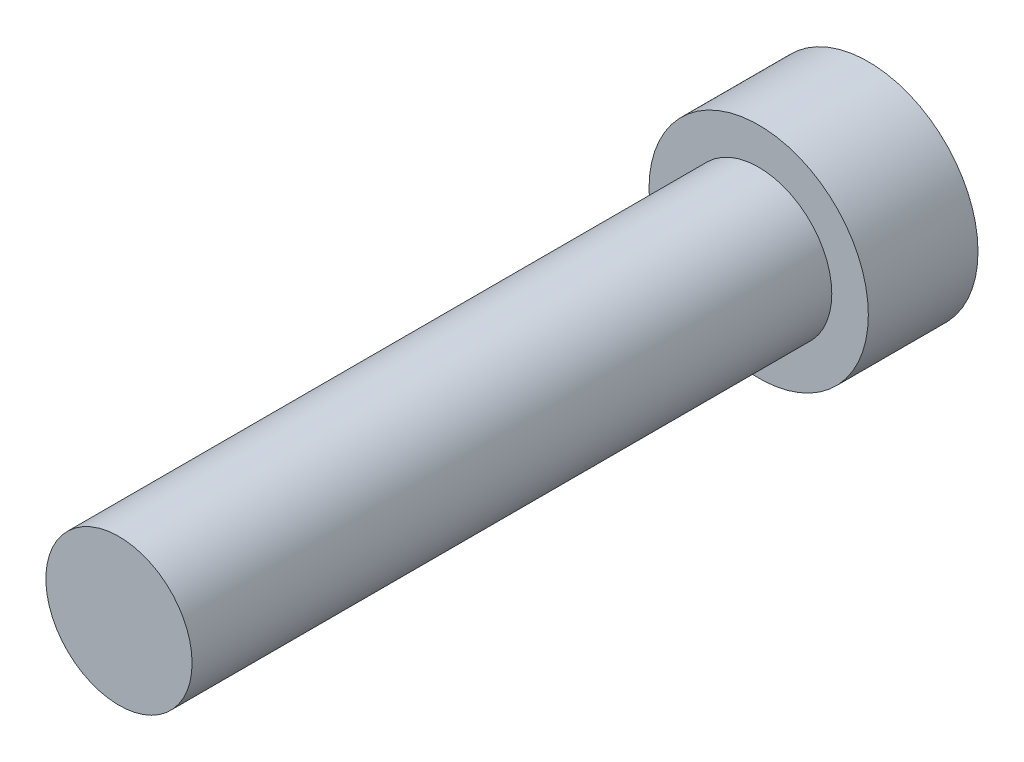
ISO-10303-21;
HEADER;
FILE_DESCRIPTION(('STEP AP214'),'2;1');
FILE_NAME('part.step','',(''),(''),'','','');
FILE_SCHEMA(('AUTOMOTIVE_DESIGN { 1 0 10303 214 1 1 1 1 }'));
ENDSEC;
DATA;
#1=APPLICATION_CONTEXT('core data for automotive mechanical design processes');
#2=APPLICATION_PROTOCOL_DEFINITION('international standard','automotive_design',2000,#1);
#3=PRODUCT_CONTEXT('',#1,'mechanical');
#4=PRODUCT('Part','Part','',(#3));
#5=PRODUCT_RELATED_PRODUCT_CATEGORY('part','',(#4));
#6=PRODUCT_DEFINITION_FORMATION('','',#4);
#7=PRODUCT_DEFINITION_CONTEXT('part definition',#1,'design');
#8=PRODUCT_DEFINITION('design','',#6,#7);
#9=PRODUCT_DEFINITION_SHAPE('','',#8);
#10=(LENGTH_UNIT() NAMED_UNIT(*) SI_UNIT(.MILLI.,.METRE.));
#11=(NAMED_UNIT(*) PLANE_ANGLE_UNIT() SI_UNIT($,.RADIAN.));
#12=(NAMED_UNIT(*) SI_UNIT($,.STERADIAN.) SOLID_ANGLE_UNIT());
#13=UNCERTAINTY_MEASURE_WITH_UNIT(LENGTH_MEASURE(1.E-05),#10,'distance_accuracy_value','');
#14=(GEOMETRIC_REPRESENTATION_CONTEXT(3) GLOBAL_UNCERTAINTY_ASSIGNED_CONTEXT((#13)) GLOBAL_UNIT_ASSIGNED_CONTEXT((#10,
#11,#12)) REPRESENTATION_CONTEXT('',''));
#15=CARTESIAN_POINT('',(0.,0.,0.));
#16=DIRECTION('',(0.,0.,1.));
#17=DIRECTION('',(1.,0.,0.));
#18=AXIS2_PLACEMENT_3D('',#15,#16,#17);
#19=CARTESIAN_POINT('',(0.,0.,6.));
#20=DIRECTION('',(0.,0.,1.));
#21=DIRECTION('',(1.,0.,0.));
#22=AXIS2_PLACEMENT_3D('',#19,#20,#21);
#23=PLANE('',#22);
#24=CARTESIAN_POINT('',(0.,0.,6.));
#25=DIRECTION('',(0.,0.,1.));
#26=DIRECTION('',(1.,0.,0.));
#27=AXIS2_PLACEMENT_3D('',#24,#25,#26);
#28=CIRCLE('',#27,6.);
#29=CARTESIAN_POINT('',(6.,0.,6.));
#30=VERTEX_POINT('',#29);
#31=EDGE_CURVE('E11',#30,#30,#28,.T.);
#32=ORIENTED_EDGE('',*,*,#31,.T.);
#33=EDGE_LOOP('',(#32));
#34=FACE_BOUND('',#33,.T.);
#35=CARTESIAN_POINT('',(0.,0.,6.));
#36=DIRECTION('',(0.,0.,1.));
#37=DIRECTION('',(1.,0.,0.));
#38=AXIS2_PLACEMENT_3D('',#35,#36,#37);
#39=CIRCLE('',#38,4.);
#40=CARTESIAN_POINT('',(4.,0.,6.));
#41=VERTEX_POINT('',#40);
#42=EDGE_CURVE('E168',#41,#41,#39,.T.);
#43=ORIENTED_EDGE('',*,*,#42,.F.);
#44=EDGE_LOOP('',(#43));
#45=FACE_BOUND('',#44,.T.);
#46=ADVANCED_FACE('F32',(#34,#45),#23,.T.);
#47=CARTESIAN_POINT('',(0.,0.,0.));
#48=DIRECTION('',(0.,0.,1.));
#49=DIRECTION('',(1.,0.,0.));
#50=AXIS2_PLACEMENT_3D('',#47,#48,#49);
#51=PLANE('',#50);
#52=CARTESIAN_POINT('',(0.,0.,0.));
#53=DIRECTION('',(0.,0.,1.));
#54=DIRECTION('',(1.,0.,0.));
#55=AXIS2_PLACEMENT_3D('',#52,#53,#54);
#56=CIRCLE('',#55,6.);
#57=CARTESIAN_POINT('',(6.,0.,0.));
#58=VERTEX_POINT('',#57);
#59=EDGE_CURVE('E36',#58,#58,#56,.T.);
#60=ORIENTED_EDGE('',*,*,#59,.F.);
#61=EDGE_LOOP('',(#60));
#62=FACE_BOUND('',#61,.T.);
#63=DIRECTION('',(0.5,0.866025403784439,0.));
#64=VECTOR('',#63,1.);
#65=CARTESIAN_POINT('',(1.73205080756888,-3.,0.));
#66=LINE('',#65,#64);
#67=CARTESIAN_POINT('',(1.73205080756888,-3.,0.));
#68=VERTEX_POINT('',#67);
#69=CARTESIAN_POINT('',(3.46410161513775,0.,0.));
#70=VERTEX_POINT('',#69);
#71=EDGE_CURVE('E47',#68,#70,#66,.T.);
#72=ORIENTED_EDGE('',*,*,#71,.T.);
#73=DIRECTION('',(-0.5,0.866025403784439,0.));
#74=VECTOR('',#73,1.);
#75=CARTESIAN_POINT('',(3.46410161513775,0.,0.));
#76=LINE('',#75,#74);
#77=CARTESIAN_POINT('',(1.73205080756888,3.,0.));
#78=VERTEX_POINT('',#77);
#79=EDGE_CURVE('E107',#70,#78,#76,.T.);
#80=ORIENTED_EDGE('',*,*,#79,.T.);
#81=DIRECTION('',(-1.,0.,0.));
#82=VECTOR('',#81,1.);
#83=CARTESIAN_POINT('',(1.73205080756888,3.,0.));
#84=LINE('',#83,#82);
#85=CARTESIAN_POINT('',(-1.73205080756888,3.,0.));
#86=VERTEX_POINT('',#85);
#87=EDGE_CURVE('E105',#78,#86,#84,.T.);
#88=ORIENTED_EDGE('',*,*,#87,.T.);
#89=DIRECTION('',(-0.5,-0.866025403784439,0.));
#90=VECTOR('',#89,1.);
#91=CARTESIAN_POINT('',(-1.73205080756888,3.,0.));
#92=LINE('',#91,#90);
#93=CARTESIAN_POINT('',(-3.46410161513776,0.,0.));
#94=VERTEX_POINT('',#93);
#95=EDGE_CURVE('E83',#86,#94,#92,.T.);
#96=ORIENTED_EDGE('',*,*,#95,.T.);
#97=DIRECTION('',(0.5,-0.866025403784439,0.));
#98=VECTOR('',#97,1.);
#99=CARTESIAN_POINT('',(-3.46410161513776,0.,0.));
#100=LINE('',#99,#98);
#101=CARTESIAN_POINT('',(-1.73205080756888,-3.,0.));
#102=VERTEX_POINT('',#101);
#103=EDGE_CURVE('E94',#94,#102,#100,.T.);
#104=ORIENTED_EDGE('',*,*,#103,.T.);
#105=DIRECTION('',(1.,0.,0.));
#106=VECTOR('',#105,1.);
#107=CARTESIAN_POINT('',(-1.73205080756888,-3.,0.));
#108=LINE('',#107,#106);
#109=EDGE_CURVE('E100',#102,#68,#108,.T.);
#110=ORIENTED_EDGE('',*,*,#109,.T.);
#111=EDGE_LOOP('',(#72,#80,#88,#96,#104,#110));
#112=FACE_BOUND('',#111,.T.);
#113=ADVANCED_FACE('F102',(#62,#112),#51,.F.);
#114=CARTESIAN_POINT('',(0.,0.,6.));
#115=DIRECTION('',(0.,0.,-1.));
#116=DIRECTION('',(-1.,0.,0.));
#117=AXIS2_PLACEMENT_3D('',#114,#115,#116);
#118=CYLINDRICAL_SURFACE('',#117,6.);
#119=ORIENTED_EDGE('',*,*,#31,.F.);
#120=EDGE_LOOP('',(#119));
#121=FACE_BOUND('',#120,.T.);
#122=ORIENTED_EDGE('',*,*,#59,.T.);
#123=EDGE_LOOP('',(#122));
#124=FACE_BOUND('',#123,.T.);
#125=ADVANCED_FACE('F34',(#121,#124),#118,.T.);
#126=CARTESIAN_POINT('',(1.73205080756888,-3.,6.));
#127=DIRECTION('',(-0.866025403784439,0.5,0.));
#128=DIRECTION('',(-0.5,-0.866025403784439,0.));
#129=AXIS2_PLACEMENT_3D('',#126,#127,#128);
#130=PLANE('',#129);
#131=ORIENTED_EDGE('',*,*,#71,.F.);
#132=DIRECTION('',(0.,0.,-1.));
#133=VECTOR('',#132,1.);
#134=CARTESIAN_POINT('',(1.73205080756888,-3.,6.));
#135=LINE('',#134,#133);
#136=CARTESIAN_POINT('',(1.73205080756888,-3.,6.));
#137=VERTEX_POINT('',#136);
#138=EDGE_CURVE('E112',#137,#68,#135,.T.);
#139=ORIENTED_EDGE('',*,*,#138,.F.);
#140=DIRECTION('',(0.5,0.866025403784439,0.));
#141=VECTOR('',#140,1.);
#142=CARTESIAN_POINT('',(1.73205080756888,-3.,6.));
#143=LINE('',#142,#141);
#144=CARTESIAN_POINT('',(3.46410161513775,0.,6.));
#145=VERTEX_POINT('',#144);
#146=EDGE_CURVE('E56',#137,#145,#143,.T.);
#147=ORIENTED_EDGE('',*,*,#146,.T.);
#148=DIRECTION('',(0.,0.,-1.));
#149=VECTOR('',#148,1.);
#150=CARTESIAN_POINT('',(3.46410161513775,0.,6.));
#151=LINE('',#150,#149);
#152=EDGE_CURVE('E119',#145,#70,#151,.T.);
#153=ORIENTED_EDGE('',*,*,#152,.T.);
#154=EDGE_LOOP('',(#131,#139,#147,#153));
#155=FACE_BOUND('',#154,.T.);
#156=ADVANCED_FACE('F130',(#155),#130,.T.);
#157=CARTESIAN_POINT('',(3.46410161513775,0.,6.));
#158=DIRECTION('',(-0.866025403784438,-0.5,0.));
#159=DIRECTION('',(0.5,-0.866025403784439,0.));
#160=AXIS2_PLACEMENT_3D('',#157,#158,#159);
#161=PLANE('',#160);
#162=ORIENTED_EDGE('',*,*,#79,.F.);
#163=ORIENTED_EDGE('',*,*,#152,.F.);
#164=DIRECTION('',(-0.5,0.866025403784439,0.));
#165=VECTOR('',#164,1.);
#166=CARTESIAN_POINT('',(3.46410161513775,0.,6.));
#167=LINE('',#166,#165);
#168=CARTESIAN_POINT('',(1.73205080756888,3.,6.));
#169=VERTEX_POINT('',#168);
#170=EDGE_CURVE('E175',#145,#169,#167,.T.);
#171=ORIENTED_EDGE('',*,*,#170,.T.);
#172=DIRECTION('',(0.,0.,-1.));
#173=VECTOR('',#172,1.);
#174=CARTESIAN_POINT('',(1.73205080756888,3.,6.));
#175=LINE('',#174,#173);
#176=EDGE_CURVE('E117',#169,#78,#175,.T.);
#177=ORIENTED_EDGE('',*,*,#176,.T.);
#178=EDGE_LOOP('',(#162,#163,#171,#177));
#179=FACE_BOUND('',#178,.T.);
#180=ADVANCED_FACE('F137',(#179),#161,.T.);
#181=CARTESIAN_POINT('',(1.73205080756888,3.,6.));
#182=DIRECTION('',(0.,-1.,0.));
#183=DIRECTION('',(0.,0.,-1.));
#184=AXIS2_PLACEMENT_3D('',#181,#182,#183);
#185=PLANE('',#184);
#186=ORIENTED_EDGE('',*,*,#87,.F.);
#187=ORIENTED_EDGE('',*,*,#176,.F.);
#188=DIRECTION('',(-1.,0.,0.));
#189=VECTOR('',#188,1.);
#190=CARTESIAN_POINT('',(1.73205080756888,3.,6.));
#191=LINE('',#190,#189);
#192=CARTESIAN_POINT('',(-1.73205080756888,3.,6.));
#193=VERTEX_POINT('',#192);
#194=EDGE_CURVE('E178',#169,#193,#191,.T.);
#195=ORIENTED_EDGE('',*,*,#194,.T.);
#196=DIRECTION('',(0.,0.,-1.));
#197=VECTOR('',#196,1.);
#198=CARTESIAN_POINT('',(-1.73205080756888,3.,6.));
#199=LINE('',#198,#197);
#200=EDGE_CURVE('E90',#193,#86,#199,.T.);
#201=ORIENTED_EDGE('',*,*,#200,.T.);
#202=EDGE_LOOP('',(#186,#187,#195,#201));
#203=FACE_BOUND('',#202,.T.);
#204=ADVANCED_FACE('F140',(#203),#185,.T.);
#205=CARTESIAN_POINT('',(-1.73205080756888,3.,6.));
#206=DIRECTION('',(0.866025403784439,-0.5,0.));
#207=DIRECTION('',(0.5,0.866025403784439,0.));
#208=AXIS2_PLACEMENT_3D('',#205,#206,#207);
#209=PLANE('',#208);
#210=ORIENTED_EDGE('',*,*,#95,.F.);
#211=ORIENTED_EDGE('',*,*,#200,.F.);
#212=DIRECTION('',(-0.5,-0.866025403784439,0.));
#213=VECTOR('',#212,1.);
#214=CARTESIAN_POINT('',(-1.73205080756888,3.,6.));
#215=LINE('',#214,#213);
#216=CARTESIAN_POINT('',(-3.46410161513776,0.,6.));
#217=VERTEX_POINT('',#216);
#218=EDGE_CURVE('E87',#193,#217,#215,.T.);
#219=ORIENTED_EDGE('',*,*,#218,.T.);
#220=DIRECTION('',(0.,0.,-1.));
#221=VECTOR('',#220,1.);
#222=CARTESIAN_POINT('',(-3.46410161513776,0.,6.));
#223=LINE('',#222,#221);
#224=EDGE_CURVE('E78',#217,#94,#223,.T.);
#225=ORIENTED_EDGE('',*,*,#224,.T.);
#226=EDGE_LOOP('',(#210,#211,#219,#225));
#227=FACE_BOUND('',#226,.T.);
#228=ADVANCED_FACE('F80',(#227),#209,.T.);
#229=CARTESIAN_POINT('',(-3.46410161513776,0.,6.));
#230=DIRECTION('',(0.866025403784438,0.5,0.));
#231=DIRECTION('',(-0.5,0.866025403784439,0.));
#232=AXIS2_PLACEMENT_3D('',#229,#230,#231);
#233=PLANE('',#232);
#234=ORIENTED_EDGE('',*,*,#103,.F.);
#235=ORIENTED_EDGE('',*,*,#224,.F.);
#236=DIRECTION('',(0.5,-0.866025403784439,0.));
#237=VECTOR('',#236,1.);
#238=CARTESIAN_POINT('',(-3.46410161513776,0.,6.));
#239=LINE('',#238,#237);
#240=CARTESIAN_POINT('',(-1.73205080756888,-3.,6.));
#241=VERTEX_POINT('',#240);
#242=EDGE_CURVE('E182',#217,#241,#239,.T.);
#243=ORIENTED_EDGE('',*,*,#242,.T.);
#244=DIRECTION('',(0.,0.,-1.));
#245=VECTOR('',#244,1.);
#246=CARTESIAN_POINT('',(-1.73205080756888,-3.,6.));
#247=LINE('',#246,#245);
#248=EDGE_CURVE('E91',#241,#102,#247,.T.);
#249=ORIENTED_EDGE('',*,*,#248,.T.);
#250=EDGE_LOOP('',(#234,#235,#243,#249));
#251=FACE_BOUND('',#250,.T.);
#252=ADVANCED_FACE('F95',(#251),#233,.T.);
#253=CARTESIAN_POINT('',(-1.73205080756888,-3.,6.));
#254=DIRECTION('',(0.,1.,0.));
#255=DIRECTION('',(-1.,0.,0.));
#256=AXIS2_PLACEMENT_3D('',#253,#254,#255);
#257=PLANE('',#256);
#258=ORIENTED_EDGE('',*,*,#109,.F.);
#259=ORIENTED_EDGE('',*,*,#248,.F.);
#260=DIRECTION('',(1.,0.,0.));
#261=VECTOR('',#260,1.);
#262=CARTESIAN_POINT('',(-1.73205080756888,-3.,6.));
#263=LINE('',#262,#261);
#264=EDGE_CURVE('E114',#241,#137,#263,.T.);
#265=ORIENTED_EDGE('',*,*,#264,.T.);
#266=ORIENTED_EDGE('',*,*,#138,.T.);
#267=EDGE_LOOP('',(#258,#259,#265,#266));
#268=FACE_BOUND('',#267,.T.);
#269=ADVANCED_FACE('F149',(#268),#257,.T.);
#270=CARTESIAN_POINT('',(0.,0.,6.));
#271=DIRECTION('',(0.,0.,1.));
#272=DIRECTION('',(1.,0.,0.));
#273=AXIS2_PLACEMENT_3D('',#270,#271,#272);
#274=PLANE('',#273);
#275=ORIENTED_EDGE('',*,*,#146,.F.);
#276=ORIENTED_EDGE('',*,*,#264,.F.);
#277=ORIENTED_EDGE('',*,*,#242,.F.);
#278=ORIENTED_EDGE('',*,*,#218,.F.);
#279=ORIENTED_EDGE('',*,*,#194,.F.);
#280=ORIENTED_EDGE('',*,*,#170,.F.);
#281=EDGE_LOOP('',(#275,#276,#277,#278,#279,#280));
#282=FACE_BOUND('',#281,.T.);
#283=ADVANCED_FACE('F152',(#282),#274,.F.);
#284=CARTESIAN_POINT('',(0.,0.,41.));
#285=DIRECTION('',(0.,0.,-1.));
#286=DIRECTION('',(-1.,0.,0.));
#287=AXIS2_PLACEMENT_3D('',#284,#285,#286);
#288=CYLINDRICAL_SURFACE('',#287,4.);
#289=CARTESIAN_POINT('',(0.,0.,41.));
#290=DIRECTION('',(0.,0.,1.));
#291=DIRECTION('',(1.,0.,0.));
#292=AXIS2_PLACEMENT_3D('',#289,#290,#291);
#293=CIRCLE('',#292,4.);
#294=CARTESIAN_POINT('',(4.,0.,41.));
#295=VERTEX_POINT('',#294);
#296=EDGE_CURVE('E167',#295,#295,#293,.T.);
#297=ORIENTED_EDGE('',*,*,#296,.F.);
#298=EDGE_LOOP('',(#297));
#299=FACE_BOUND('',#298,.T.);
#300=ORIENTED_EDGE('',*,*,#42,.T.);
#301=EDGE_LOOP('',(#300));
#302=FACE_BOUND('',#301,.T.);
#303=ADVANCED_FACE('F154',(#299,#302),#288,.T.);
#304=CARTESIAN_POINT('',(0.,0.,41.));
#305=DIRECTION('',(0.,0.,1.));
#306=DIRECTION('',(1.,0.,0.));
#307=AXIS2_PLACEMENT_3D('',#304,#305,#306);
#308=PLANE('',#307);
#309=ORIENTED_EDGE('',*,*,#296,.T.);
#310=EDGE_LOOP('',(#309));
#311=FACE_BOUND('',#310,.T.);
#312=ADVANCED_FACE('F157',(#311),#308,.T.);
#313=CLOSED_SHELL('',(#46,#113,#125,#156,#180,#204,#228,#252,#269,#283,#303,#312));
#314=MANIFOLD_SOLID_BREP('B2',#313);
#315=ADVANCED_BREP_SHAPE_REPRESENTATION('',(#18,#314),#14);
#316=SHAPE_DEFINITION_REPRESENTATION(#9,#315);
ENDSEC;
END-ISO-10303-21;
